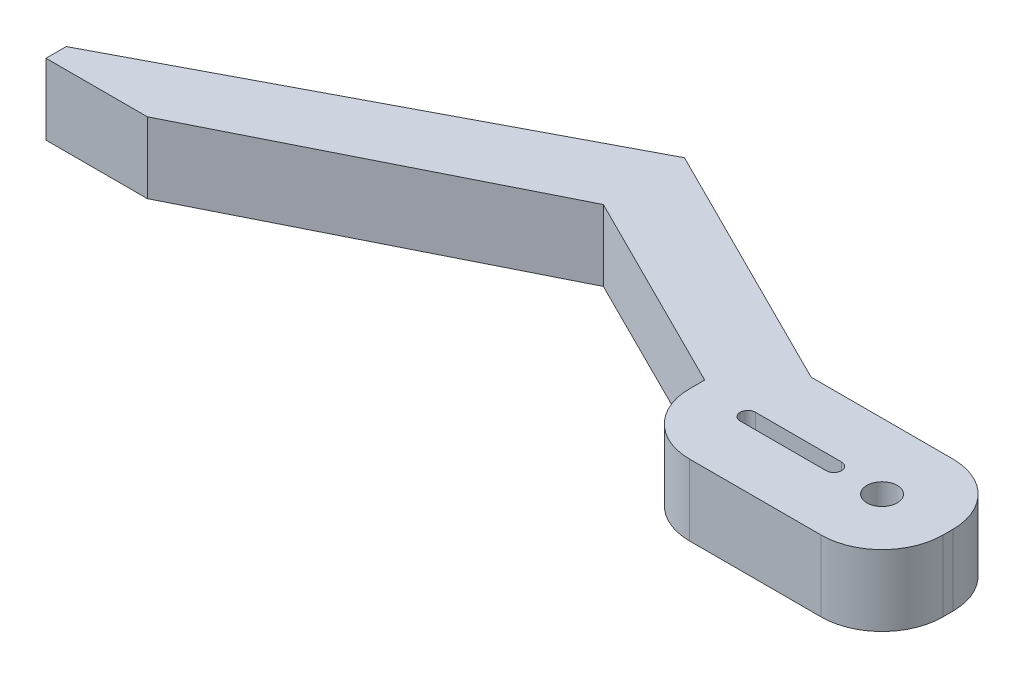
ISO-10303-21;
HEADER;
FILE_DESCRIPTION(('STEP AP214'),'2;1');
FILE_NAME('part.step','',(''),(''),'','','');
FILE_SCHEMA(('AUTOMOTIVE_DESIGN { 1 0 10303 214 1 1 1 1 }'));
ENDSEC;
DATA;
#1=APPLICATION_CONTEXT('core data for automotive mechanical design processes');
#2=APPLICATION_PROTOCOL_DEFINITION('international standard','automotive_design',2000,#1);
#3=PRODUCT_CONTEXT('',#1,'mechanical');
#4=PRODUCT('Part','Part','',(#3));
#5=PRODUCT_RELATED_PRODUCT_CATEGORY('part','',(#4));
#6=PRODUCT_DEFINITION_FORMATION('','',#4);
#7=PRODUCT_DEFINITION_CONTEXT('part definition',#1,'design');
#8=PRODUCT_DEFINITION('design','',#6,#7);
#9=PRODUCT_DEFINITION_SHAPE('','',#8);
#10=(LENGTH_UNIT() NAMED_UNIT(*) SI_UNIT(.MILLI.,.METRE.));
#11=(NAMED_UNIT(*) PLANE_ANGLE_UNIT() SI_UNIT($,.RADIAN.));
#12=(NAMED_UNIT(*) SI_UNIT($,.STERADIAN.) SOLID_ANGLE_UNIT());
#13=UNCERTAINTY_MEASURE_WITH_UNIT(LENGTH_MEASURE(1.E-05),#10,'distance_accuracy_value','');
#14=(GEOMETRIC_REPRESENTATION_CONTEXT(3) GLOBAL_UNCERTAINTY_ASSIGNED_CONTEXT((#13)) GLOBAL_UNIT_ASSIGNED_CONTEXT((#10,
#11,#12)) REPRESENTATION_CONTEXT('',''));
#15=CARTESIAN_POINT('',(0.,0.,0.));
#16=DIRECTION('',(0.,0.,1.));
#17=DIRECTION('',(1.,0.,0.));
#18=AXIS2_PLACEMENT_3D('',#15,#16,#17);
#19=CARTESIAN_POINT('',(9.2,7.,-18.4));
#20=DIRECTION('',(0.447213595499958,0.,-0.894427190999916));
#21=DIRECTION('',(-0.894427190999916,0.,-0.447213595499958));
#22=AXIS2_PLACEMENT_3D('',#19,#20,#21);
#23=PLANE('',#22);
#24=DIRECTION('',(0.894427190999916,0.,0.447213595499958));
#25=VECTOR('',#24,1.);
#26=CARTESIAN_POINT('',(9.2,0.,-18.4));
#27=LINE('',#26,#25);
#28=CARTESIAN_POINT('',(0.,0.,-23.));
#29=VERTEX_POINT('',#28);
#30=CARTESIAN_POINT('',(25.,0.,-10.5));
#31=VERTEX_POINT('',#30);
#32=EDGE_CURVE('E254',#29,#31,#27,.T.);
#33=ORIENTED_EDGE('',*,*,#32,.F.);
#34=DIRECTION('',(0.,-1.,0.));
#35=VECTOR('',#34,1.);
#36=CARTESIAN_POINT('',(0.,7.,-23.));
#37=LINE('',#36,#35);
#38=CARTESIAN_POINT('',(0.,7.,-23.));
#39=VERTEX_POINT('',#38);
#40=EDGE_CURVE('E216',#39,#29,#37,.T.);
#41=ORIENTED_EDGE('',*,*,#40,.F.);
#42=DIRECTION('',(0.894427190999916,0.,0.447213595499958));
#43=VECTOR('',#42,1.);
#44=CARTESIAN_POINT('',(9.2,7.,-18.4));
#45=LINE('',#44,#43);
#46=CARTESIAN_POINT('',(25.,7.,-10.5));
#47=VERTEX_POINT('',#46);
#48=EDGE_CURVE('E223',#39,#47,#45,.T.);
#49=ORIENTED_EDGE('',*,*,#48,.T.);
#50=DIRECTION('',(0.,-1.,0.));
#51=VECTOR('',#50,1.);
#52=CARTESIAN_POINT('',(25.,7.,-10.5));
#53=LINE('',#52,#51);
#54=EDGE_CURVE('E203',#47,#31,#53,.T.);
#55=ORIENTED_EDGE('',*,*,#54,.T.);
#56=EDGE_LOOP('',(#33,#41,#49,#55));
#57=FACE_BOUND('',#56,.T.);
#58=ADVANCED_FACE('F71',(#57),#23,.T.);
#59=CARTESIAN_POINT('',(-9.46594806467418,7.,-18.0303772660461));
#60=DIRECTION('',(-0.46483389898992,0.,-0.885397902837944));
#61=DIRECTION('',(-0.885397902837944,0.,0.46483389898992));
#62=AXIS2_PLACEMENT_3D('',#59,#60,#61);
#63=PLANE('',#62);
#64=DIRECTION('',(0.885397902837944,0.,-0.46483389898992));
#65=VECTOR('',#64,1.);
#66=CARTESIAN_POINT('',(-9.46594806467418,0.,-18.0303772660461));
#67=LINE('',#66,#65);
#68=CARTESIAN_POINT('',(-40.,0.,-2.));
#69=VERTEX_POINT('',#68);
#70=EDGE_CURVE('E256',#69,#29,#67,.T.);
#71=ORIENTED_EDGE('',*,*,#70,.F.);
#72=DIRECTION('',(0.,-1.,0.));
#73=VECTOR('',#72,1.);
#74=CARTESIAN_POINT('',(-40.,7.,-2.));
#75=LINE('',#74,#73);
#76=CARTESIAN_POINT('',(-40.,7.,-2.));
#77=VERTEX_POINT('',#76);
#78=EDGE_CURVE('E276',#77,#69,#75,.T.);
#79=ORIENTED_EDGE('',*,*,#78,.F.);
#80=DIRECTION('',(0.885397902837944,0.,-0.46483389898992));
#81=VECTOR('',#80,1.);
#82=CARTESIAN_POINT('',(-9.46594806467418,7.,-18.0303772660461));
#83=LINE('',#82,#81);
#84=EDGE_CURVE('E231',#77,#39,#83,.T.);
#85=ORIENTED_EDGE('',*,*,#84,.T.);
#86=ORIENTED_EDGE('',*,*,#40,.T.);
#87=EDGE_LOOP('',(#71,#79,#85,#86));
#88=FACE_BOUND('',#87,.T.);
#89=ADVANCED_FACE('F530',(#88),#63,.T.);
#90=CARTESIAN_POINT('',(-40.,7.,0.));
#91=DIRECTION('',(-1.,0.,0.));
#92=DIRECTION('',(0.,0.,1.));
#93=AXIS2_PLACEMENT_3D('',#90,#91,#92);
#94=PLANE('',#93);
#95=DIRECTION('',(0.,0.,-1.));
#96=VECTOR('',#95,1.);
#97=CARTESIAN_POINT('',(-40.,0.,0.));
#98=LINE('',#97,#96);
#99=CARTESIAN_POINT('',(-40.,0.,0.));
#100=VERTEX_POINT('',#99);
#101=EDGE_CURVE('E260',#100,#69,#98,.T.);
#102=ORIENTED_EDGE('',*,*,#101,.F.);
#103=DIRECTION('',(0.,-1.,0.));
#104=VECTOR('',#103,1.);
#105=CARTESIAN_POINT('',(-40.,7.,0.));
#106=LINE('',#105,#104);
#107=CARTESIAN_POINT('',(-40.,7.,0.));
#108=VERTEX_POINT('',#107);
#109=EDGE_CURVE('E274',#108,#100,#106,.T.);
#110=ORIENTED_EDGE('',*,*,#109,.F.);
#111=DIRECTION('',(0.,0.,-1.));
#112=VECTOR('',#111,1.);
#113=CARTESIAN_POINT('',(-40.,7.,0.));
#114=LINE('',#113,#112);
#115=EDGE_CURVE('E234',#108,#77,#114,.T.);
#116=ORIENTED_EDGE('',*,*,#115,.T.);
#117=ORIENTED_EDGE('',*,*,#78,.T.);
#118=EDGE_LOOP('',(#102,#110,#116,#117));
#119=FACE_BOUND('',#118,.T.);
#120=ADVANCED_FACE('F520',(#119),#94,.T.);
#121=CARTESIAN_POINT('',(0.,7.,0.));
#122=DIRECTION('',(0.,0.,1.));
#123=DIRECTION('',(1.,0.,0.));
#124=AXIS2_PLACEMENT_3D('',#121,#122,#123);
#125=PLANE('',#124);
#126=DIRECTION('',(-1.,0.,0.));
#127=VECTOR('',#126,1.);
#128=CARTESIAN_POINT('',(0.,0.,0.));
#129=LINE('',#128,#127);
#130=CARTESIAN_POINT('',(-30.,0.,0.));
#131=VERTEX_POINT('',#130);
#132=EDGE_CURVE('E263',#131,#100,#129,.T.);
#133=ORIENTED_EDGE('',*,*,#132,.F.);
#134=DIRECTION('',(0.,-1.,0.));
#135=VECTOR('',#134,1.);
#136=CARTESIAN_POINT('',(-30.,7.,0.));
#137=LINE('',#136,#135);
#138=CARTESIAN_POINT('',(-30.,7.,0.));
#139=VERTEX_POINT('',#138);
#140=EDGE_CURVE('E272',#139,#131,#137,.T.);
#141=ORIENTED_EDGE('',*,*,#140,.F.);
#142=DIRECTION('',(-1.,0.,0.));
#143=VECTOR('',#142,1.);
#144=CARTESIAN_POINT('',(0.,7.,0.));
#145=LINE('',#144,#143);
#146=EDGE_CURVE('E245',#139,#108,#145,.T.);
#147=ORIENTED_EDGE('',*,*,#146,.T.);
#148=ORIENTED_EDGE('',*,*,#109,.T.);
#149=EDGE_LOOP('',(#133,#141,#147,#148));
#150=FACE_BOUND('',#149,.T.);
#151=ADVANCED_FACE('F510',(#150),#125,.T.);
#152=CARTESIAN_POINT('',(-6.,7.,-12.));
#153=DIRECTION('',(-0.447213595499958,0.,-0.894427190999916));
#154=DIRECTION('',(-0.894427190999916,0.,0.447213595499958));
#155=AXIS2_PLACEMENT_3D('',#152,#153,#154);
#156=PLANE('',#155);
#157=DIRECTION('',(0.894427190999916,0.,-0.447213595499958));
#158=VECTOR('',#157,1.);
#159=CARTESIAN_POINT('',(-6.,0.,-12.));
#160=LINE('',#159,#158);
#161=CARTESIAN_POINT('',(0.,0.,-15.));
#162=VERTEX_POINT('',#161);
#163=EDGE_CURVE('E237',#131,#162,#160,.T.);
#164=ORIENTED_EDGE('',*,*,#163,.T.);
#165=DIRECTION('',(0.,-1.,0.));
#166=VECTOR('',#165,1.);
#167=CARTESIAN_POINT('',(0.,7.,-15.));
#168=LINE('',#167,#166);
#169=CARTESIAN_POINT('',(0.,7.,-15.));
#170=VERTEX_POINT('',#169);
#171=EDGE_CURVE('E269',#170,#162,#168,.T.);
#172=ORIENTED_EDGE('',*,*,#171,.F.);
#173=DIRECTION('',(0.894427190999916,0.,-0.447213595499958));
#174=VECTOR('',#173,1.);
#175=CARTESIAN_POINT('',(-6.,7.,-12.));
#176=LINE('',#175,#174);
#177=EDGE_CURVE('E248',#139,#170,#176,.T.);
#178=ORIENTED_EDGE('',*,*,#177,.F.);
#179=ORIENTED_EDGE('',*,*,#140,.T.);
#180=EDGE_LOOP('',(#164,#172,#178,#179));
#181=FACE_BOUND('',#180,.T.);
#182=ADVANCED_FACE('F498',(#181),#156,.F.);
#183=CARTESIAN_POINT('',(6.,7.,-12.));
#184=DIRECTION('',(0.447213595499958,0.,-0.894427190999916));
#185=DIRECTION('',(-0.894427190999916,0.,-0.447213595499958));
#186=AXIS2_PLACEMENT_3D('',#183,#184,#185);
#187=PLANE('',#186);
#188=DIRECTION('',(0.894427190999916,0.,0.447213595499958));
#189=VECTOR('',#188,1.);
#190=CARTESIAN_POINT('',(6.,0.,-12.));
#191=LINE('',#190,#189);
#192=CARTESIAN_POINT('',(20.,0.,-5.));
#193=VERTEX_POINT('',#192);
#194=EDGE_CURVE('E232',#162,#193,#191,.T.);
#195=ORIENTED_EDGE('',*,*,#194,.T.);
#196=DIRECTION('',(0.,-1.,0.));
#197=VECTOR('',#196,1.);
#198=CARTESIAN_POINT('',(20.,7.,-5.));
#199=LINE('',#198,#197);
#200=CARTESIAN_POINT('',(20.,7.,-5.));
#201=VERTEX_POINT('',#200);
#202=EDGE_CURVE('E253',#201,#193,#199,.T.);
#203=ORIENTED_EDGE('',*,*,#202,.F.);
#204=DIRECTION('',(0.894427190999916,0.,0.447213595499958));
#205=VECTOR('',#204,1.);
#206=CARTESIAN_POINT('',(6.,7.,-12.));
#207=LINE('',#206,#205);
#208=EDGE_CURVE('E250',#170,#201,#207,.T.);
#209=ORIENTED_EDGE('',*,*,#208,.F.);
#210=ORIENTED_EDGE('',*,*,#171,.T.);
#211=EDGE_LOOP('',(#195,#203,#209,#210));
#212=FACE_BOUND('',#211,.T.);
#213=ADVANCED_FACE('F493',(#212),#187,.F.);
#214=CARTESIAN_POINT('',(0.,0.,0.));
#215=DIRECTION('',(0.,1.,0.));
#216=DIRECTION('',(0.,0.,1.));
#217=AXIS2_PLACEMENT_3D('',#214,#215,#216);
#218=PLANE('',#217);
#219=CARTESIAN_POINT('',(33.75,0.,-4.));
#220=DIRECTION('',(0.,1.,0.));
#221=DIRECTION('',(0.,0.,1.));
#222=AXIS2_PLACEMENT_3D('',#219,#220,#221);
#223=CIRCLE('',#222,0.75);
#224=CARTESIAN_POINT('',(33.75,0.,-3.25));
#225=VERTEX_POINT('',#224);
#226=CARTESIAN_POINT('',(34.5,0.,-4.));
#227=VERTEX_POINT('',#226);
#228=EDGE_CURVE('E329',#225,#227,#223,.T.);
#229=ORIENTED_EDGE('',*,*,#228,.T.);
#230=CARTESIAN_POINT('',(33.75,0.,-4.));
#231=DIRECTION('',(0.,1.,0.));
#232=DIRECTION('',(0.,0.,1.));
#233=AXIS2_PLACEMENT_3D('',#230,#231,#232);
#234=CIRCLE('',#233,0.75);
#235=CARTESIAN_POINT('',(33.75,0.,-4.75));
#236=VERTEX_POINT('',#235);
#237=EDGE_CURVE('E333',#227,#236,#234,.T.);
#238=ORIENTED_EDGE('',*,*,#237,.T.);
#239=DIRECTION('',(-1.,0.,0.));
#240=VECTOR('',#239,1.);
#241=CARTESIAN_POINT('',(34.5,0.,-4.75));
#242=LINE('',#241,#240);
#243=CARTESIAN_POINT('',(25.25,0.,-4.75));
#244=VERTEX_POINT('',#243);
#245=EDGE_CURVE('E362',#236,#244,#242,.T.);
#246=ORIENTED_EDGE('',*,*,#245,.T.);
#247=CARTESIAN_POINT('',(25.25,0.,-4.));
#248=DIRECTION('',(0.,1.,0.));
#249=DIRECTION('',(0.,0.,1.));
#250=AXIS2_PLACEMENT_3D('',#247,#248,#249);
#251=CIRCLE('',#250,0.75);
#252=CARTESIAN_POINT('',(24.5,0.,-4.));
#253=VERTEX_POINT('',#252);
#254=EDGE_CURVE('E87',#244,#253,#251,.T.);
#255=ORIENTED_EDGE('',*,*,#254,.T.);
#256=CARTESIAN_POINT('',(25.25,0.,-4.));
#257=DIRECTION('',(0.,1.,0.));
#258=DIRECTION('',(0.,0.,1.));
#259=AXIS2_PLACEMENT_3D('',#256,#257,#258);
#260=CIRCLE('',#259,0.75);
#261=CARTESIAN_POINT('',(25.25,0.,-3.25));
#262=VERTEX_POINT('',#261);
#263=EDGE_CURVE('E12',#253,#262,#260,.T.);
#264=ORIENTED_EDGE('',*,*,#263,.T.);
#265=DIRECTION('',(1.,0.,0.));
#266=VECTOR('',#265,1.);
#267=CARTESIAN_POINT('',(24.5,0.,-3.25));
#268=LINE('',#267,#266);
#269=EDGE_CURVE('E358',#262,#225,#268,.T.);
#270=ORIENTED_EDGE('',*,*,#269,.T.);
#271=EDGE_LOOP('',(#229,#238,#246,#255,#264,#270));
#272=FACE_BOUND('',#271,.T.);
#273=CARTESIAN_POINT('',(38.5,0.,-4.));
#274=DIRECTION('',(0.,1.,0.));
#275=DIRECTION('',(0.,0.,1.));
#276=AXIS2_PLACEMENT_3D('',#273,#274,#275);
#277=CIRCLE('',#276,1.5);
#278=CARTESIAN_POINT('',(38.5,0.,-2.5));
#279=VERTEX_POINT('',#278);
#280=EDGE_CURVE('E240',#279,#279,#277,.T.);
#281=ORIENTED_EDGE('',*,*,#280,.T.);
#282=EDGE_LOOP('',(#281));
#283=FACE_BOUND('',#282,.T.);
#284=DIRECTION('',(-1.,0.,0.));
#285=VECTOR('',#284,1.);
#286=CARTESIAN_POINT('',(45.,0.,2.5));
#287=LINE('',#286,#285);
#288=CARTESIAN_POINT('',(39.,0.,2.5));
#289=VERTEX_POINT('',#288);
#290=CARTESIAN_POINT('',(26.,0.,2.5));
#291=VERTEX_POINT('',#290);
#292=EDGE_CURVE('E279',#289,#291,#287,.T.);
#293=ORIENTED_EDGE('',*,*,#292,.T.);
#294=CARTESIAN_POINT('',(26.,0.,-3.5));
#295=DIRECTION('',(0.,1.,0.));
#296=DIRECTION('',(0.,0.,1.));
#297=AXIS2_PLACEMENT_3D('',#294,#295,#296);
#298=CIRCLE('',#297,6.);
#299=CARTESIAN_POINT('',(20.,0.,-3.5));
#300=VERTEX_POINT('',#299);
#301=EDGE_CURVE('E301',#291,#300,#298,.F.);
#302=ORIENTED_EDGE('',*,*,#301,.T.);
#303=DIRECTION('',(0.,0.,-1.));
#304=VECTOR('',#303,1.);
#305=CARTESIAN_POINT('',(20.,0.,2.5));
#306=LINE('',#305,#304);
#307=EDGE_CURVE('E285',#300,#193,#306,.T.);
#308=ORIENTED_EDGE('',*,*,#307,.T.);
#309=ORIENTED_EDGE('',*,*,#194,.F.);
#310=ORIENTED_EDGE('',*,*,#163,.F.);
#311=ORIENTED_EDGE('',*,*,#132,.T.);
#312=ORIENTED_EDGE('',*,*,#101,.T.);
#313=ORIENTED_EDGE('',*,*,#70,.T.);
#314=ORIENTED_EDGE('',*,*,#32,.T.);
#315=DIRECTION('',(1.,0.,0.));
#316=VECTOR('',#315,1.);
#317=CARTESIAN_POINT('',(20.,0.,-10.5));
#318=LINE('',#317,#316);
#319=CARTESIAN_POINT('',(39.,0.,-10.5));
#320=VERTEX_POINT('',#319);
#321=EDGE_CURVE('E210',#31,#320,#318,.T.);
#322=ORIENTED_EDGE('',*,*,#321,.T.);
#323=CARTESIAN_POINT('',(39.,0.,-4.5));
#324=DIRECTION('',(0.,1.,0.));
#325=DIRECTION('',(0.,0.,1.));
#326=AXIS2_PLACEMENT_3D('',#323,#324,#325);
#327=CIRCLE('',#326,6.);
#328=CARTESIAN_POINT('',(45.,0.,-4.5));
#329=VERTEX_POINT('',#328);
#330=EDGE_CURVE('E299',#320,#329,#327,.F.);
#331=ORIENTED_EDGE('',*,*,#330,.T.);
#332=DIRECTION('',(0.,0.,1.));
#333=VECTOR('',#332,1.);
#334=CARTESIAN_POINT('',(45.,0.,-10.5));
#335=LINE('',#334,#333);
#336=CARTESIAN_POINT('',(45.,0.,-3.5));
#337=VERTEX_POINT('',#336);
#338=EDGE_CURVE('E288',#329,#337,#335,.T.);
#339=ORIENTED_EDGE('',*,*,#338,.T.);
#340=CARTESIAN_POINT('',(39.,0.,-3.5));
#341=DIRECTION('',(0.,1.,0.));
#342=DIRECTION('',(0.,0.,1.));
#343=AXIS2_PLACEMENT_3D('',#340,#341,#342);
#344=CIRCLE('',#343,6.);
#345=EDGE_CURVE('E297',#337,#289,#344,.F.);
#346=ORIENTED_EDGE('',*,*,#345,.T.);
#347=EDGE_LOOP('',(#293,#302,#308,#309,#310,#311,#312,#313,#314,#322,#331,#339,#346));
#348=FACE_BOUND('',#347,.T.);
#349=ADVANCED_FACE('F356',(#272,#283,#348),#218,.F.);
#350=CARTESIAN_POINT('',(0.,7.,0.));
#351=DIRECTION('',(0.,1.,0.));
#352=DIRECTION('',(0.,0.,1.));
#353=AXIS2_PLACEMENT_3D('',#350,#351,#352);
#354=PLANE('',#353);
#355=DIRECTION('',(-1.,0.,0.));
#356=VECTOR('',#355,1.);
#357=CARTESIAN_POINT('',(34.5,7.,-4.75));
#358=LINE('',#357,#356);
#359=CARTESIAN_POINT('',(33.75,7.,-4.75));
#360=VERTEX_POINT('',#359);
#361=CARTESIAN_POINT('',(25.25,7.,-4.75));
#362=VERTEX_POINT('',#361);
#363=EDGE_CURVE('E345',#360,#362,#358,.T.);
#364=ORIENTED_EDGE('',*,*,#363,.F.);
#365=CARTESIAN_POINT('',(33.75,7.,-4.));
#366=DIRECTION('',(0.,1.,0.));
#367=DIRECTION('',(0.,0.,1.));
#368=AXIS2_PLACEMENT_3D('',#365,#366,#367);
#369=CIRCLE('',#368,0.75);
#370=CARTESIAN_POINT('',(34.5,7.,-4.));
#371=VERTEX_POINT('',#370);
#372=EDGE_CURVE('E331',#360,#371,#369,.F.);
#373=ORIENTED_EDGE('',*,*,#372,.T.);
#374=CARTESIAN_POINT('',(33.75,7.,-4.));
#375=DIRECTION('',(0.,1.,0.));
#376=DIRECTION('',(0.,0.,1.));
#377=AXIS2_PLACEMENT_3D('',#374,#375,#376);
#378=CIRCLE('',#377,0.75);
#379=CARTESIAN_POINT('',(33.75,7.,-3.25));
#380=VERTEX_POINT('',#379);
#381=EDGE_CURVE('E327',#371,#380,#378,.F.);
#382=ORIENTED_EDGE('',*,*,#381,.T.);
#383=DIRECTION('',(1.,0.,0.));
#384=VECTOR('',#383,1.);
#385=CARTESIAN_POINT('',(24.5,7.,-3.25));
#386=LINE('',#385,#384);
#387=CARTESIAN_POINT('',(25.25,7.,-3.25));
#388=VERTEX_POINT('',#387);
#389=EDGE_CURVE('E340',#388,#380,#386,.T.);
#390=ORIENTED_EDGE('',*,*,#389,.F.);
#391=CARTESIAN_POINT('',(25.25,7.,-4.));
#392=DIRECTION('',(0.,1.,0.));
#393=DIRECTION('',(0.,0.,1.));
#394=AXIS2_PLACEMENT_3D('',#391,#392,#393);
#395=CIRCLE('',#394,0.75);
#396=CARTESIAN_POINT('',(24.5,7.,-4.));
#397=VERTEX_POINT('',#396);
#398=EDGE_CURVE('E80',#388,#397,#395,.F.);
#399=ORIENTED_EDGE('',*,*,#398,.T.);
#400=CARTESIAN_POINT('',(25.25,7.,-4.));
#401=DIRECTION('',(0.,1.,0.));
#402=DIRECTION('',(0.,0.,1.));
#403=AXIS2_PLACEMENT_3D('',#400,#401,#402);
#404=CIRCLE('',#403,0.75);
#405=EDGE_CURVE('E335',#397,#362,#404,.F.);
#406=ORIENTED_EDGE('',*,*,#405,.T.);
#407=EDGE_LOOP('',(#364,#373,#382,#390,#399,#406));
#408=FACE_BOUND('',#407,.T.);
#409=CARTESIAN_POINT('',(38.5,7.,-4.));
#410=DIRECTION('',(0.,1.,0.));
#411=DIRECTION('',(0.,0.,1.));
#412=AXIS2_PLACEMENT_3D('',#409,#410,#411);
#413=CIRCLE('',#412,1.49999999999999);
#414=CARTESIAN_POINT('',(38.5,7.,-2.50000000000002));
#415=VERTEX_POINT('',#414);
#416=EDGE_CURVE('E364',#415,#415,#413,.T.);
#417=ORIENTED_EDGE('',*,*,#416,.F.);
#418=EDGE_LOOP('',(#417));
#419=FACE_BOUND('',#418,.T.);
#420=DIRECTION('',(0.,0.,-1.));
#421=VECTOR('',#420,1.);
#422=CARTESIAN_POINT('',(20.,7.,2.5));
#423=LINE('',#422,#421);
#424=CARTESIAN_POINT('',(20.,7.,-3.5));
#425=VERTEX_POINT('',#424);
#426=EDGE_CURVE('E229',#425,#201,#423,.T.);
#427=ORIENTED_EDGE('',*,*,#426,.F.);
#428=CARTESIAN_POINT('',(26.,7.,-3.5));
#429=DIRECTION('',(0.,1.,0.));
#430=DIRECTION('',(0.,0.,1.));
#431=AXIS2_PLACEMENT_3D('',#428,#429,#430);
#432=CIRCLE('',#431,6.);
#433=CARTESIAN_POINT('',(26.,7.,2.5));
#434=VERTEX_POINT('',#433);
#435=EDGE_CURVE('E308',#425,#434,#432,.T.);
#436=ORIENTED_EDGE('',*,*,#435,.T.);
#437=DIRECTION('',(-1.,0.,0.));
#438=VECTOR('',#437,1.);
#439=CARTESIAN_POINT('',(45.,7.,2.5));
#440=LINE('',#439,#438);
#441=CARTESIAN_POINT('',(39.,7.,2.5));
#442=VERTEX_POINT('',#441);
#443=EDGE_CURVE('E257',#442,#434,#440,.T.);
#444=ORIENTED_EDGE('',*,*,#443,.F.);
#445=CARTESIAN_POINT('',(39.,7.,-3.5));
#446=DIRECTION('',(0.,1.,0.));
#447=DIRECTION('',(0.,0.,1.));
#448=AXIS2_PLACEMENT_3D('',#445,#446,#447);
#449=CIRCLE('',#448,6.);
#450=CARTESIAN_POINT('',(45.,7.,-3.5));
#451=VERTEX_POINT('',#450);
#452=EDGE_CURVE('E305',#442,#451,#449,.T.);
#453=ORIENTED_EDGE('',*,*,#452,.T.);
#454=DIRECTION('',(0.,0.,1.));
#455=VECTOR('',#454,1.);
#456=CARTESIAN_POINT('',(45.,7.,-10.5));
#457=LINE('',#456,#455);
#458=CARTESIAN_POINT('',(45.,7.,-4.5));
#459=VERTEX_POINT('',#458);
#460=EDGE_CURVE('E228',#459,#451,#457,.T.);
#461=ORIENTED_EDGE('',*,*,#460,.F.);
#462=CARTESIAN_POINT('',(39.,7.,-4.5));
#463=DIRECTION('',(0.,1.,0.));
#464=DIRECTION('',(0.,0.,1.));
#465=AXIS2_PLACEMENT_3D('',#462,#463,#464);
#466=CIRCLE('',#465,6.);
#467=CARTESIAN_POINT('',(39.,7.,-10.5));
#468=VERTEX_POINT('',#467);
#469=EDGE_CURVE('E227',#459,#468,#466,.T.);
#470=ORIENTED_EDGE('',*,*,#469,.T.);
#471=DIRECTION('',(1.,0.,0.));
#472=VECTOR('',#471,1.);
#473=CARTESIAN_POINT('',(20.,7.,-10.5));
#474=LINE('',#473,#472);
#475=EDGE_CURVE('E207',#47,#468,#474,.T.);
#476=ORIENTED_EDGE('',*,*,#475,.F.);
#477=ORIENTED_EDGE('',*,*,#48,.F.);
#478=ORIENTED_EDGE('',*,*,#84,.F.);
#479=ORIENTED_EDGE('',*,*,#115,.F.);
#480=ORIENTED_EDGE('',*,*,#146,.F.);
#481=ORIENTED_EDGE('',*,*,#177,.T.);
#482=ORIENTED_EDGE('',*,*,#208,.T.);
#483=EDGE_LOOP('',(#427,#436,#444,#453,#461,#470,#476,#477,#478,#479,#480,#481,#482));
#484=FACE_BOUND('',#483,.T.);
#485=ADVANCED_FACE('F221',(#408,#419,#484),#354,.T.);
#486=CARTESIAN_POINT('',(45.,7.,2.5));
#487=DIRECTION('',(0.,0.,1.));
#488=DIRECTION('',(1.,0.,0.));
#489=AXIS2_PLACEMENT_3D('',#486,#487,#488);
#490=PLANE('',#489);
#491=ORIENTED_EDGE('',*,*,#443,.T.);
#492=DIRECTION('',(0.,-1.,0.));
#493=VECTOR('',#492,1.);
#494=CARTESIAN_POINT('',(26.,7.,2.5));
#495=LINE('',#494,#493);
#496=EDGE_CURVE('E294',#434,#291,#495,.T.);
#497=ORIENTED_EDGE('',*,*,#496,.T.);
#498=ORIENTED_EDGE('',*,*,#292,.F.);
#499=DIRECTION('',(0.,-1.,0.));
#500=VECTOR('',#499,1.);
#501=CARTESIAN_POINT('',(39.,7.,2.5));
#502=LINE('',#501,#500);
#503=EDGE_CURVE('E215',#289,#442,#502,.F.);
#504=ORIENTED_EDGE('',*,*,#503,.T.);
#505=EDGE_LOOP('',(#491,#497,#498,#504));
#506=FACE_BOUND('',#505,.T.);
#507=ADVANCED_FACE('F392',(#506),#490,.T.);
#508=CARTESIAN_POINT('',(45.,7.,-10.5));
#509=DIRECTION('',(1.,0.,0.));
#510=DIRECTION('',(0.,0.,-1.));
#511=AXIS2_PLACEMENT_3D('',#508,#509,#510);
#512=PLANE('',#511);
#513=ORIENTED_EDGE('',*,*,#338,.F.);
#514=DIRECTION('',(0.,-1.,0.));
#515=VECTOR('',#514,1.);
#516=CARTESIAN_POINT('',(45.,7.,-4.5));
#517=LINE('',#516,#515);
#518=EDGE_CURVE('E315',#329,#459,#517,.F.);
#519=ORIENTED_EDGE('',*,*,#518,.T.);
#520=ORIENTED_EDGE('',*,*,#460,.T.);
#521=DIRECTION('',(0.,-1.,0.));
#522=VECTOR('',#521,1.);
#523=CARTESIAN_POINT('',(45.,7.,-3.5));
#524=LINE('',#523,#522);
#525=EDGE_CURVE('E312',#451,#337,#524,.T.);
#526=ORIENTED_EDGE('',*,*,#525,.T.);
#527=EDGE_LOOP('',(#513,#519,#520,#526));
#528=FACE_BOUND('',#527,.T.);
#529=ADVANCED_FACE('F394',(#528),#512,.T.);
#530=CARTESIAN_POINT('',(20.,7.,-10.5));
#531=DIRECTION('',(0.,0.,-1.));
#532=DIRECTION('',(-1.,0.,0.));
#533=AXIS2_PLACEMENT_3D('',#530,#531,#532);
#534=PLANE('',#533);
#535=ORIENTED_EDGE('',*,*,#475,.T.);
#536=DIRECTION('',(0.,-1.,0.));
#537=VECTOR('',#536,1.);
#538=CARTESIAN_POINT('',(39.,7.,-10.5));
#539=LINE('',#538,#537);
#540=EDGE_CURVE('E310',#468,#320,#539,.T.);
#541=ORIENTED_EDGE('',*,*,#540,.T.);
#542=ORIENTED_EDGE('',*,*,#321,.F.);
#543=ORIENTED_EDGE('',*,*,#54,.F.);
#544=EDGE_LOOP('',(#535,#541,#542,#543));
#545=FACE_BOUND('',#544,.T.);
#546=ADVANCED_FACE('F205',(#545),#534,.T.);
#547=CARTESIAN_POINT('',(20.,7.,2.5));
#548=DIRECTION('',(-1.,0.,0.));
#549=DIRECTION('',(0.,0.,1.));
#550=AXIS2_PLACEMENT_3D('',#547,#548,#549);
#551=PLANE('',#550);
#552=ORIENTED_EDGE('',*,*,#307,.F.);
#553=DIRECTION('',(0.,-1.,0.));
#554=VECTOR('',#553,1.);
#555=CARTESIAN_POINT('',(20.,7.,-3.5));
#556=LINE('',#555,#554);
#557=EDGE_CURVE('E303',#300,#425,#556,.F.);
#558=ORIENTED_EDGE('',*,*,#557,.T.);
#559=ORIENTED_EDGE('',*,*,#426,.T.);
#560=ORIENTED_EDGE('',*,*,#202,.T.);
#561=EDGE_LOOP('',(#552,#558,#559,#560));
#562=FACE_BOUND('',#561,.T.);
#563=ADVANCED_FACE('F378',(#562),#551,.T.);
#564=CARTESIAN_POINT('',(38.5,7.,-4.));
#565=DIRECTION('',(0.,1.,0.));
#566=DIRECTION('',(0.,0.,1.));
#567=AXIS2_PLACEMENT_3D('',#564,#565,#566);
#568=CYLINDRICAL_SURFACE('',#567,1.49999999999999);
#569=ORIENTED_EDGE('',*,*,#280,.F.);
#570=EDGE_LOOP('',(#569));
#571=FACE_BOUND('',#570,.T.);
#572=ORIENTED_EDGE('',*,*,#416,.T.);
#573=EDGE_LOOP('',(#572));
#574=FACE_BOUND('',#573,.T.);
#575=ADVANCED_FACE('F375',(#571,#574),#568,.F.);
#576=CARTESIAN_POINT('',(26.,7.,-3.5));
#577=DIRECTION('',(0.,-1.,0.));
#578=DIRECTION('',(0.,0.,-1.));
#579=AXIS2_PLACEMENT_3D('',#576,#577,#578);
#580=CYLINDRICAL_SURFACE('',#579,6.);
#581=ORIENTED_EDGE('',*,*,#435,.F.);
#582=ORIENTED_EDGE('',*,*,#557,.F.);
#583=ORIENTED_EDGE('',*,*,#301,.F.);
#584=ORIENTED_EDGE('',*,*,#496,.F.);
#585=EDGE_LOOP('',(#581,#582,#583,#584));
#586=FACE_BOUND('',#585,.T.);
#587=ADVANCED_FACE('F377',(#586),#580,.T.);
#588=CARTESIAN_POINT('',(39.,7.,-4.5));
#589=DIRECTION('',(0.,-1.,0.));
#590=DIRECTION('',(0.,0.,-1.));
#591=AXIS2_PLACEMENT_3D('',#588,#589,#590);
#592=CYLINDRICAL_SURFACE('',#591,6.);
#593=ORIENTED_EDGE('',*,*,#469,.F.);
#594=ORIENTED_EDGE('',*,*,#518,.F.);
#595=ORIENTED_EDGE('',*,*,#330,.F.);
#596=ORIENTED_EDGE('',*,*,#540,.F.);
#597=EDGE_LOOP('',(#593,#594,#595,#596));
#598=FACE_BOUND('',#597,.T.);
#599=ADVANCED_FACE('F384',(#598),#592,.T.);
#600=CARTESIAN_POINT('',(39.,7.,-3.5));
#601=DIRECTION('',(0.,-1.,0.));
#602=DIRECTION('',(0.,0.,-1.));
#603=AXIS2_PLACEMENT_3D('',#600,#601,#602);
#604=CYLINDRICAL_SURFACE('',#603,6.);
#605=ORIENTED_EDGE('',*,*,#452,.F.);
#606=ORIENTED_EDGE('',*,*,#503,.F.);
#607=ORIENTED_EDGE('',*,*,#345,.F.);
#608=ORIENTED_EDGE('',*,*,#525,.F.);
#609=EDGE_LOOP('',(#605,#606,#607,#608));
#610=FACE_BOUND('',#609,.T.);
#611=ADVANCED_FACE('F409',(#610),#604,.T.);
#612=CARTESIAN_POINT('',(34.5,0.,-4.75));
#613=DIRECTION('',(0.,0.,-1.));
#614=DIRECTION('',(-1.,0.,0.));
#615=AXIS2_PLACEMENT_3D('',#612,#613,#614);
#616=PLANE('',#615);
#617=ORIENTED_EDGE('',*,*,#245,.F.);
#618=DIRECTION('',(0.,1.,0.));
#619=VECTOR('',#618,1.);
#620=CARTESIAN_POINT('',(33.75,7.,-4.75));
#621=LINE('',#620,#619);
#622=EDGE_CURVE('E325',#236,#360,#621,.T.);
#623=ORIENTED_EDGE('',*,*,#622,.T.);
#624=ORIENTED_EDGE('',*,*,#363,.T.);
#625=DIRECTION('',(0.,1.,0.));
#626=VECTOR('',#625,1.);
#627=CARTESIAN_POINT('',(25.25,0.,-4.75));
#628=LINE('',#627,#626);
#629=EDGE_CURVE('E322',#362,#244,#628,.F.);
#630=ORIENTED_EDGE('',*,*,#629,.T.);
#631=EDGE_LOOP('',(#617,#623,#624,#630));
#632=FACE_BOUND('',#631,.T.);
#633=ADVANCED_FACE('F413',(#632),#616,.F.);
#634=CARTESIAN_POINT('',(24.5,0.,-3.25));
#635=DIRECTION('',(0.,0.,1.));
#636=DIRECTION('',(1.,0.,0.));
#637=AXIS2_PLACEMENT_3D('',#634,#635,#636);
#638=PLANE('',#637);
#639=ORIENTED_EDGE('',*,*,#389,.T.);
#640=DIRECTION('',(0.,1.,0.));
#641=VECTOR('',#640,1.);
#642=CARTESIAN_POINT('',(33.75,0.,-3.25));
#643=LINE('',#642,#641);
#644=EDGE_CURVE('E319',#380,#225,#643,.F.);
#645=ORIENTED_EDGE('',*,*,#644,.T.);
#646=ORIENTED_EDGE('',*,*,#269,.F.);
#647=DIRECTION('',(0.,1.,0.));
#648=VECTOR('',#647,1.);
#649=CARTESIAN_POINT('',(25.25,7.,-3.25));
#650=LINE('',#649,#648);
#651=EDGE_CURVE('E317',#262,#388,#650,.T.);
#652=ORIENTED_EDGE('',*,*,#651,.T.);
#653=EDGE_LOOP('',(#639,#645,#646,#652));
#654=FACE_BOUND('',#653,.T.);
#655=ADVANCED_FACE('F360',(#654),#638,.F.);
#656=CARTESIAN_POINT('',(33.75,0.,-4.));
#657=DIRECTION('',(0.,-1.,0.));
#658=DIRECTION('',(0.,0.,-1.));
#659=AXIS2_PLACEMENT_3D('',#656,#657,#658);
#660=CYLINDRICAL_SURFACE('',#659,0.75);
#661=ORIENTED_EDGE('',*,*,#622,.F.);
#662=ORIENTED_EDGE('',*,*,#237,.F.);
#663=DIRECTION('',(0.,1.,0.));
#664=VECTOR('',#663,1.);
#665=CARTESIAN_POINT('',(34.5,0.,-4.));
#666=LINE('',#665,#664);
#667=EDGE_CURVE('E338',#371,#227,#666,.F.);
#668=ORIENTED_EDGE('',*,*,#667,.F.);
#669=ORIENTED_EDGE('',*,*,#372,.F.);
#670=EDGE_LOOP('',(#661,#662,#668,#669));
#671=FACE_BOUND('',#670,.T.);
#672=ADVANCED_FACE('F418',(#671),#660,.F.);
#673=CARTESIAN_POINT('',(33.75,0.,-4.));
#674=DIRECTION('',(0.,-1.,0.));
#675=DIRECTION('',(0.,0.,-1.));
#676=AXIS2_PLACEMENT_3D('',#673,#674,#675);
#677=CYLINDRICAL_SURFACE('',#676,0.75);
#678=ORIENTED_EDGE('',*,*,#228,.F.);
#679=ORIENTED_EDGE('',*,*,#644,.F.);
#680=ORIENTED_EDGE('',*,*,#381,.F.);
#681=ORIENTED_EDGE('',*,*,#667,.T.);
#682=EDGE_LOOP('',(#678,#679,#680,#681));
#683=FACE_BOUND('',#682,.T.);
#684=ADVANCED_FACE('F415',(#683),#677,.F.);
#685=CARTESIAN_POINT('',(25.25,0.,-4.));
#686=DIRECTION('',(0.,-1.,0.));
#687=DIRECTION('',(0.,0.,-1.));
#688=AXIS2_PLACEMENT_3D('',#685,#686,#687);
#689=CYLINDRICAL_SURFACE('',#688,0.75);
#690=ORIENTED_EDGE('',*,*,#651,.F.);
#691=ORIENTED_EDGE('',*,*,#263,.F.);
#692=DIRECTION('',(0.,1.,0.));
#693=VECTOR('',#692,1.);
#694=CARTESIAN_POINT('',(24.5,0.,-4.));
#695=LINE('',#694,#693);
#696=EDGE_CURVE('E75',#397,#253,#695,.F.);
#697=ORIENTED_EDGE('',*,*,#696,.F.);
#698=ORIENTED_EDGE('',*,*,#398,.F.);
#699=EDGE_LOOP('',(#690,#691,#697,#698));
#700=FACE_BOUND('',#699,.T.);
#701=ADVANCED_FACE('F73',(#700),#689,.F.);
#702=CARTESIAN_POINT('',(25.25,0.,-4.));
#703=DIRECTION('',(0.,-1.,0.));
#704=DIRECTION('',(0.,0.,-1.));
#705=AXIS2_PLACEMENT_3D('',#702,#703,#704);
#706=CYLINDRICAL_SURFACE('',#705,0.75);
#707=ORIENTED_EDGE('',*,*,#254,.F.);
#708=ORIENTED_EDGE('',*,*,#629,.F.);
#709=ORIENTED_EDGE('',*,*,#405,.F.);
#710=ORIENTED_EDGE('',*,*,#696,.T.);
#711=EDGE_LOOP('',(#707,#708,#709,#710));
#712=FACE_BOUND('',#711,.T.);
#713=ADVANCED_FACE('F350',(#712),#706,.F.);
#714=CLOSED_SHELL('',(#58,#89,#120,#151,#182,#213,#349,#485,#507,#529,#546,#563,#575,#587,#599,
#611,#633,#655,#672,#684,#701,#713));
#715=MANIFOLD_SOLID_BREP('B2',#714);
#716=ADVANCED_BREP_SHAPE_REPRESENTATION('',(#18,#715),#14);
#717=SHAPE_DEFINITION_REPRESENTATION(#9,#716);
ENDSEC;
END-ISO-10303-21;
